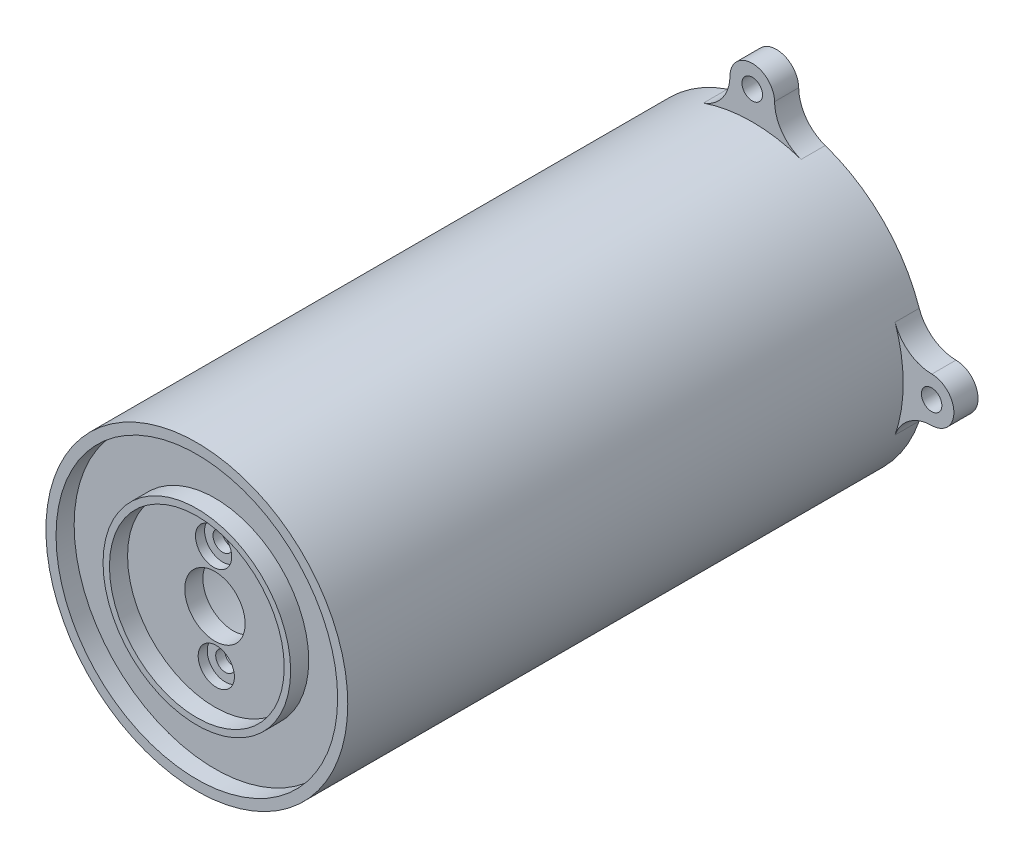
ISO-10303-21;
HEADER;
FILE_DESCRIPTION(('STEP AP214'),'2;1');
FILE_NAME('part.step','',(''),(''),'','','');
FILE_SCHEMA(('AUTOMOTIVE_DESIGN { 1 0 10303 214 1 1 1 1 }'));
ENDSEC;
DATA;
#1=APPLICATION_CONTEXT('core data for automotive mechanical design processes');
#2=APPLICATION_PROTOCOL_DEFINITION('international standard','automotive_design',2000,#1);
#3=PRODUCT_CONTEXT('',#1,'mechanical');
#4=PRODUCT('Part','Part','',(#3));
#5=PRODUCT_RELATED_PRODUCT_CATEGORY('part','',(#4));
#6=PRODUCT_DEFINITION_FORMATION('','',#4);
#7=PRODUCT_DEFINITION_CONTEXT('part definition',#1,'design');
#8=PRODUCT_DEFINITION('design','',#6,#7);
#9=PRODUCT_DEFINITION_SHAPE('','',#8);
#10=(LENGTH_UNIT() NAMED_UNIT(*) SI_UNIT(.MILLI.,.METRE.));
#11=(NAMED_UNIT(*) PLANE_ANGLE_UNIT() SI_UNIT($,.RADIAN.));
#12=(NAMED_UNIT(*) SI_UNIT($,.STERADIAN.) SOLID_ANGLE_UNIT());
#13=UNCERTAINTY_MEASURE_WITH_UNIT(LENGTH_MEASURE(1.E-05),#10,'distance_accuracy_value','');
#14=(GEOMETRIC_REPRESENTATION_CONTEXT(3) GLOBAL_UNCERTAINTY_ASSIGNED_CONTEXT((#13)) GLOBAL_UNIT_ASSIGNED_CONTEXT((#10,
#11,#12)) REPRESENTATION_CONTEXT('',''));
#15=CARTESIAN_POINT('',(0.,0.,0.));
#16=DIRECTION('',(0.,0.,1.));
#17=DIRECTION('',(1.,0.,0.));
#18=AXIS2_PLACEMENT_3D('',#15,#16,#17);
#19=CARTESIAN_POINT('',(0.,0.,93.));
#20=DIRECTION('',(0.,0.,1.));
#21=DIRECTION('',(1.,0.,0.));
#22=AXIS2_PLACEMENT_3D('',#19,#20,#21);
#23=PLANE('',#22);
#24=CARTESIAN_POINT('',(-0.222147672715639,8.49709658715891,93.));
#25=DIRECTION('',(0.,0.,1.));
#26=DIRECTION('',(1.,0.,0.));
#27=AXIS2_PLACEMENT_3D('',#24,#25,#26);
#28=CIRCLE('',#27,3.);
#29=CARTESIAN_POINT('',(2.77785232728436,8.49709658715891,93.));
#30=VERTEX_POINT('',#29);
#31=EDGE_CURVE('E289',#30,#30,#28,.T.);
#32=ORIENTED_EDGE('',*,*,#31,.F.);
#33=EDGE_LOOP('',(#32));
#34=FACE_BOUND('',#33,.T.);
#35=CARTESIAN_POINT('',(0.222147672715695,-8.49709658715891,93.));
#36=DIRECTION('',(0.,0.,1.));
#37=DIRECTION('',(1.,0.,0.));
#38=AXIS2_PLACEMENT_3D('',#35,#36,#37);
#39=CIRCLE('',#38,3.);
#40=CARTESIAN_POINT('',(3.22214767271569,-8.49709658715891,93.));
#41=VERTEX_POINT('',#40);
#42=EDGE_CURVE('E292',#41,#41,#39,.T.);
#43=ORIENTED_EDGE('',*,*,#42,.F.);
#44=EDGE_LOOP('',(#43));
#45=FACE_BOUND('',#44,.T.);
#46=CARTESIAN_POINT('',(0.,0.,93.));
#47=DIRECTION('',(0.,0.,1.));
#48=DIRECTION('',(1.,0.,0.));
#49=AXIS2_PLACEMENT_3D('',#46,#47,#48);
#50=CIRCLE('',#49,5.);
#51=CARTESIAN_POINT('',(5.00000000000003,0.,93.));
#52=VERTEX_POINT('',#51);
#53=EDGE_CURVE('E306',#52,#52,#50,.T.);
#54=ORIENTED_EDGE('',*,*,#53,.F.);
#55=EDGE_LOOP('',(#54));
#56=FACE_BOUND('',#55,.T.);
#57=CARTESIAN_POINT('',(0.,0.,93.));
#58=DIRECTION('',(0.,0.,1.));
#59=DIRECTION('',(1.,0.,0.));
#60=AXIS2_PLACEMENT_3D('',#57,#58,#59);
#61=CIRCLE('',#60,14.4751675605041);
#62=CARTESIAN_POINT('',(14.4751675605041,0.,93.));
#63=VERTEX_POINT('',#62);
#64=EDGE_CURVE('E12',#63,#63,#61,.F.);
#65=ORIENTED_EDGE('',*,*,#64,.F.);
#66=EDGE_LOOP('',(#65));
#67=FACE_BOUND('',#66,.T.);
#68=ADVANCED_FACE('F45',(#34,#45,#56,#67),#23,.T.);
#69=CARTESIAN_POINT('',(0.222147672715695,-8.49709658715891,93.));
#70=DIRECTION('',(0.,0.,-1.));
#71=DIRECTION('',(-1.,0.,0.));
#72=AXIS2_PLACEMENT_3D('',#69,#70,#71);
#73=CYLINDRICAL_SURFACE('',#72,1.60000000000014);
#74=CARTESIAN_POINT('',(0.222147672715695,-8.49709658715891,90.));
#75=DIRECTION('',(0.,0.,1.));
#76=DIRECTION('',(1.,0.,0.));
#77=AXIS2_PLACEMENT_3D('',#74,#75,#76);
#78=CIRCLE('',#77,1.60000000000014);
#79=CARTESIAN_POINT('',(1.82214767271583,-8.49709658715891,90.));
#80=VERTEX_POINT('',#79);
#81=EDGE_CURVE('E301',#80,#80,#78,.T.);
#82=ORIENTED_EDGE('',*,*,#81,.F.);
#83=EDGE_LOOP('',(#82));
#84=FACE_BOUND('',#83,.T.);
#85=CARTESIAN_POINT('',(0.222147672715695,-8.49709658715891,91.5));
#86=DIRECTION('',(0.,0.,1.));
#87=DIRECTION('',(1.,0.,0.));
#88=AXIS2_PLACEMENT_3D('',#85,#86,#87);
#89=CIRCLE('',#88,1.60000000000014);
#90=CARTESIAN_POINT('',(1.82214767271583,-8.49709658715891,91.5));
#91=VERTEX_POINT('',#90);
#92=EDGE_CURVE('E302',#91,#91,#89,.T.);
#93=ORIENTED_EDGE('',*,*,#92,.T.);
#94=EDGE_LOOP('',(#93));
#95=FACE_BOUND('',#94,.T.);
#96=ADVANCED_FACE('F349',(#84,#95),#73,.F.);
#97=CARTESIAN_POINT('',(-0.222147672715639,8.49709658715891,93.));
#98=DIRECTION('',(0.,0.,-1.));
#99=DIRECTION('',(-1.,0.,0.));
#100=AXIS2_PLACEMENT_3D('',#97,#98,#99);
#101=CYLINDRICAL_SURFACE('',#100,1.60000000000014);
#102=CARTESIAN_POINT('',(-0.222147672715639,8.49709658715891,90.));
#103=DIRECTION('',(0.,0.,1.));
#104=DIRECTION('',(1.,0.,0.));
#105=AXIS2_PLACEMENT_3D('',#102,#103,#104);
#106=CIRCLE('',#105,1.60000000000014);
#107=CARTESIAN_POINT('',(1.3778523272845,8.49709658715891,90.));
#108=VERTEX_POINT('',#107);
#109=EDGE_CURVE('E298',#108,#108,#106,.T.);
#110=ORIENTED_EDGE('',*,*,#109,.F.);
#111=EDGE_LOOP('',(#110));
#112=FACE_BOUND('',#111,.T.);
#113=CARTESIAN_POINT('',(-0.222147672715639,8.49709658715891,91.5));
#114=DIRECTION('',(0.,0.,1.));
#115=DIRECTION('',(1.,0.,0.));
#116=AXIS2_PLACEMENT_3D('',#113,#114,#115);
#117=CIRCLE('',#116,1.60000000000014);
#118=CARTESIAN_POINT('',(1.3778523272845,8.49709658715891,91.5));
#119=VERTEX_POINT('',#118);
#120=EDGE_CURVE('E288',#119,#119,#117,.T.);
#121=ORIENTED_EDGE('',*,*,#120,.T.);
#122=EDGE_LOOP('',(#121));
#123=FACE_BOUND('',#122,.T.);
#124=ADVANCED_FACE('F355',(#112,#123),#101,.F.);
#125=CARTESIAN_POINT('',(0.,0.,0.));
#126=DIRECTION('',(0.,0.,1.));
#127=DIRECTION('',(1.,0.,0.));
#128=AXIS2_PLACEMENT_3D('',#125,#126,#127);
#129=PLANE('',#128);
#130=CARTESIAN_POINT('',(0.,0.,0.));
#131=DIRECTION('',(0.,0.,1.));
#132=DIRECTION('',(1.,0.,0.));
#133=AXIS2_PLACEMENT_3D('',#130,#131,#132);
#134=CIRCLE('',#133,25.);
#135=CARTESIAN_POINT('',(23.6554109952273,8.08835772248491,0.));
#136=VERTEX_POINT('',#135);
#137=CARTESIAN_POINT('',(8.08835772248466,23.6554109952273,0.));
#138=VERTEX_POINT('',#137);
#139=EDGE_CURVE('E318',#136,#138,#134,.T.);
#140=ORIENTED_EDGE('',*,*,#139,.F.);
#141=CARTESIAN_POINT('',(29.8058178539863,10.191330730331,0.));
#142=DIRECTION('',(0.,0.,1.));
#143=DIRECTION('',(-1.,0.,0.));
#144=AXIS2_PLACEMENT_3D('',#141,#142,#143);
#145=CIRCLE('',#144,6.5);
#146=CARTESIAN_POINT('',(29.7425959776503,3.69163819957597,0.));
#147=VERTEX_POINT('',#146);
#148=EDGE_CURVE('E244',#136,#147,#145,.T.);
#149=ORIENTED_EDGE('',*,*,#148,.T.);
#150=CARTESIAN_POINT('',(29.706687772358,1.03720345996027E-13,0.));
#151=DIRECTION('',(0.,0.,-1.));
#152=DIRECTION('',(-1.,0.,0.));
#153=AXIS2_PLACEMENT_3D('',#150,#151,#152);
#154=CIRCLE('',#153,3.69181283325347);
#155=CARTESIAN_POINT('',(29.7425959776503,-3.69163819957576,0.));
#156=VERTEX_POINT('',#155);
#157=EDGE_CURVE('E186',#147,#156,#154,.T.);
#158=ORIENTED_EDGE('',*,*,#157,.T.);
#159=CARTESIAN_POINT('',(29.8058178539864,-10.1913307303308,0.));
#160=DIRECTION('',(0.,0.,1.));
#161=DIRECTION('',(1.,0.,0.));
#162=AXIS2_PLACEMENT_3D('',#159,#160,#161);
#163=CIRCLE('',#162,6.5);
#164=CARTESIAN_POINT('',(23.6554109952273,-8.08835772248474,0.));
#165=VERTEX_POINT('',#164);
#166=EDGE_CURVE('E183',#156,#165,#163,.T.);
#167=ORIENTED_EDGE('',*,*,#166,.T.);
#168=CARTESIAN_POINT('',(8.08835772248484,-23.6554109952273,0.));
#169=VERTEX_POINT('',#168);
#170=EDGE_CURVE('E317',#169,#165,#134,.T.);
#171=ORIENTED_EDGE('',*,*,#170,.F.);
#172=CARTESIAN_POINT('',(10.1913307303309,-29.8058178539864,0.));
#173=DIRECTION('',(0.,0.,1.));
#174=DIRECTION('',(-1.,0.,0.));
#175=AXIS2_PLACEMENT_3D('',#172,#173,#174);
#176=CIRCLE('',#175,6.5);
#177=CARTESIAN_POINT('',(3.69163819957586,-29.7425959776503,0.));
#178=VERTEX_POINT('',#177);
#179=EDGE_CURVE('E219',#169,#178,#176,.T.);
#180=ORIENTED_EDGE('',*,*,#179,.T.);
#181=CARTESIAN_POINT('',(0.,-29.706687772358,0.));
#182=DIRECTION('',(0.,0.,-1.));
#183=DIRECTION('',(-1.,0.,0.));
#184=AXIS2_PLACEMENT_3D('',#181,#182,#183);
#185=CIRCLE('',#184,3.69181283325347);
#186=CARTESIAN_POINT('',(-3.69163819957586,-29.7425959776503,0.));
#187=VERTEX_POINT('',#186);
#188=EDGE_CURVE('E162',#178,#187,#185,.T.);
#189=ORIENTED_EDGE('',*,*,#188,.T.);
#190=CARTESIAN_POINT('',(-10.1913307303309,-29.8058178539864,0.));
#191=DIRECTION('',(0.,0.,1.));
#192=DIRECTION('',(1.,0.,0.));
#193=AXIS2_PLACEMENT_3D('',#190,#191,#192);
#194=CIRCLE('',#193,6.5);
#195=CARTESIAN_POINT('',(-8.08835772248483,-23.6554109952273,0.));
#196=VERTEX_POINT('',#195);
#197=EDGE_CURVE('E223',#187,#196,#194,.T.);
#198=ORIENTED_EDGE('',*,*,#197,.T.);
#199=CARTESIAN_POINT('',(-23.6554109952272,-8.08835772248509,0.));
#200=VERTEX_POINT('',#199);
#201=EDGE_CURVE('E547',#200,#196,#134,.T.);
#202=ORIENTED_EDGE('',*,*,#201,.F.);
#203=CARTESIAN_POINT('',(-29.8058178539863,-10.1913307303312,0.));
#204=DIRECTION('',(0.,0.,1.));
#205=DIRECTION('',(-1.,0.,0.));
#206=AXIS2_PLACEMENT_3D('',#203,#204,#205);
#207=CIRCLE('',#206,6.5);
#208=CARTESIAN_POINT('',(-29.7425959776502,-3.69163819957619,0.));
#209=VERTEX_POINT('',#208);
#210=EDGE_CURVE('E226',#200,#209,#207,.T.);
#211=ORIENTED_EDGE('',*,*,#210,.T.);
#212=CARTESIAN_POINT('',(-29.706687772358,-3.18099931891989E-13,0.));
#213=DIRECTION('',(0.,0.,-1.));
#214=DIRECTION('',(-1.,0.,0.));
#215=AXIS2_PLACEMENT_3D('',#212,#213,#214);
#216=CIRCLE('',#215,3.69181283325347);
#217=CARTESIAN_POINT('',(-29.7425959776503,3.69163819957555,0.));
#218=VERTEX_POINT('',#217);
#219=EDGE_CURVE('E229',#209,#218,#216,.T.);
#220=ORIENTED_EDGE('',*,*,#219,.T.);
#221=CARTESIAN_POINT('',(-29.8058178539865,10.1913307303306,0.));
#222=DIRECTION('',(0.,0.,1.));
#223=DIRECTION('',(1.,0.,0.));
#224=AXIS2_PLACEMENT_3D('',#221,#222,#223);
#225=CIRCLE('',#224,6.5);
#226=CARTESIAN_POINT('',(-23.6554109952274,8.08835772248457,0.));
#227=VERTEX_POINT('',#226);
#228=EDGE_CURVE('E232',#218,#227,#225,.T.);
#229=ORIENTED_EDGE('',*,*,#228,.T.);
#230=CARTESIAN_POINT('',(-8.08835772248499,23.6554109952272,0.));
#231=VERTEX_POINT('',#230);
#232=EDGE_CURVE('E320',#231,#227,#134,.T.);
#233=ORIENTED_EDGE('',*,*,#232,.F.);
#234=CARTESIAN_POINT('',(-10.1913307303311,29.8058178539863,0.));
#235=DIRECTION('',(0.,0.,1.));
#236=DIRECTION('',(-1.,0.,0.));
#237=AXIS2_PLACEMENT_3D('',#234,#235,#236);
#238=CIRCLE('',#237,6.5);
#239=CARTESIAN_POINT('',(-3.69163819957607,29.7425959776502,0.));
#240=VERTEX_POINT('',#239);
#241=EDGE_CURVE('E235',#231,#240,#238,.T.);
#242=ORIENTED_EDGE('',*,*,#241,.T.);
#243=CARTESIAN_POINT('',(-2.03971245040101E-13,29.706687772358,0.));
#244=DIRECTION('',(0.,0.,-1.));
#245=DIRECTION('',(-1.,0.,0.));
#246=AXIS2_PLACEMENT_3D('',#243,#244,#245);
#247=CIRCLE('',#246,3.69181283325347);
#248=CARTESIAN_POINT('',(3.69163819957566,29.7425959776503,0.));
#249=VERTEX_POINT('',#248);
#250=EDGE_CURVE('E238',#240,#249,#247,.T.);
#251=ORIENTED_EDGE('',*,*,#250,.T.);
#252=CARTESIAN_POINT('',(10.1913307303307,29.8058178539865,0.));
#253=DIRECTION('',(0.,0.,1.));
#254=DIRECTION('',(1.,0.,0.));
#255=AXIS2_PLACEMENT_3D('',#252,#253,#254);
#256=CIRCLE('',#255,6.5);
#257=EDGE_CURVE('E241',#249,#138,#256,.T.);
#258=ORIENTED_EDGE('',*,*,#257,.T.);
#259=EDGE_LOOP('',(#140,#149,#158,#167,#171,#180,#189,#198,#202,#211,#220,#229,#233,#242,#251,#258));
#260=FACE_BOUND('',#259,.T.);
#261=CARTESIAN_POINT('',(0.,0.,0.));
#262=DIRECTION('',(0.,0.,1.));
#263=DIRECTION('',(1.,0.,0.));
#264=AXIS2_PLACEMENT_3D('',#261,#262,#263);
#265=CIRCLE('',#264,24.);
#266=CARTESIAN_POINT('',(-24.,0.,0.));
#267=VERTEX_POINT('',#266);
#268=EDGE_CURVE('E314',#267,#267,#265,.T.);
#269=ORIENTED_EDGE('',*,*,#268,.T.);
#270=EDGE_LOOP('',(#269));
#271=FACE_BOUND('',#270,.T.);
#272=CARTESIAN_POINT('',(-29.706687772358,-3.18099931891989E-13,0.));
#273=DIRECTION('',(0.,0.,-1.));
#274=DIRECTION('',(-1.,0.,0.));
#275=AXIS2_PLACEMENT_3D('',#272,#273,#274);
#276=CIRCLE('',#275,1.7);
#277=CARTESIAN_POINT('',(-31.406687772358,-3.18099931891989E-13,0.));
#278=VERTEX_POINT('',#277);
#279=EDGE_CURVE('E497',#278,#278,#276,.T.);
#280=ORIENTED_EDGE('',*,*,#279,.F.);
#281=EDGE_LOOP('',(#280));
#282=FACE_BOUND('',#281,.T.);
#283=CARTESIAN_POINT('',(0.,-29.706687772358,0.));
#284=DIRECTION('',(0.,0.,-1.));
#285=DIRECTION('',(-1.,0.,0.));
#286=AXIS2_PLACEMENT_3D('',#283,#284,#285);
#287=CIRCLE('',#286,1.7);
#288=CARTESIAN_POINT('',(-1.7,-29.706687772358,0.));
#289=VERTEX_POINT('',#288);
#290=EDGE_CURVE('E189',#289,#289,#287,.T.);
#291=ORIENTED_EDGE('',*,*,#290,.F.);
#292=EDGE_LOOP('',(#291));
#293=FACE_BOUND('',#292,.T.);
#294=CARTESIAN_POINT('',(29.706687772358,1.03720345996027E-13,0.));
#295=DIRECTION('',(0.,0.,-1.));
#296=DIRECTION('',(-1.,0.,0.));
#297=AXIS2_PLACEMENT_3D('',#294,#295,#296);
#298=CIRCLE('',#297,1.7);
#299=CARTESIAN_POINT('',(28.0066877723579,1.03720345996027E-13,0.));
#300=VERTEX_POINT('',#299);
#301=EDGE_CURVE('E504',#300,#300,#298,.T.);
#302=ORIENTED_EDGE('',*,*,#301,.F.);
#303=EDGE_LOOP('',(#302));
#304=FACE_BOUND('',#303,.T.);
#305=CARTESIAN_POINT('',(-2.03971245040101E-13,29.706687772358,0.));
#306=DIRECTION('',(0.,0.,-1.));
#307=DIRECTION('',(-1.,0.,0.));
#308=AXIS2_PLACEMENT_3D('',#305,#306,#307);
#309=CIRCLE('',#308,1.7);
#310=CARTESIAN_POINT('',(-1.7000000000002,29.706687772358,0.));
#311=VERTEX_POINT('',#310);
#312=EDGE_CURVE('E507',#311,#311,#309,.T.);
#313=ORIENTED_EDGE('',*,*,#312,.F.);
#314=EDGE_LOOP('',(#313));
#315=FACE_BOUND('',#314,.T.);
#316=ADVANCED_FACE('F467',(#260,#271,#282,#293,#304,#315),#129,.F.);
#317=CARTESIAN_POINT('',(0.,0.,90.));
#318=DIRECTION('',(0.,0.,-1.));
#319=DIRECTION('',(-1.,0.,0.));
#320=AXIS2_PLACEMENT_3D('',#317,#318,#319);
#321=CYLINDRICAL_SURFACE('',#320,25.);
#322=DIRECTION('',(0.,0.,-1.));
#323=VECTOR('',#322,1.);
#324=CARTESIAN_POINT('',(-23.6554109952274,8.08835772248457,4.));
#325=LINE('',#324,#323);
#326=CARTESIAN_POINT('',(-23.6554109952274,8.08835772248457,4.));
#327=VERTEX_POINT('',#326);
#328=EDGE_CURVE('E268',#327,#227,#325,.T.);
#329=ORIENTED_EDGE('',*,*,#328,.F.);
#330=CARTESIAN_POINT('',(0.,0.,4.));
#331=DIRECTION('',(0.,0.,-1.));
#332=DIRECTION('',(-1.,0.,0.));
#333=AXIS2_PLACEMENT_3D('',#330,#331,#332);
#334=CIRCLE('',#333,25.);
#335=CARTESIAN_POINT('',(-23.6554109952272,-8.08835772248508,4.));
#336=VERTEX_POINT('',#335);
#337=EDGE_CURVE('E250',#336,#327,#334,.T.);
#338=ORIENTED_EDGE('',*,*,#337,.F.);
#339=DIRECTION('',(0.,0.,-1.));
#340=VECTOR('',#339,1.);
#341=CARTESIAN_POINT('',(-23.6554109952272,-8.08835772248509,4.));
#342=LINE('',#341,#340);
#343=EDGE_CURVE('E275',#336,#200,#342,.T.);
#344=ORIENTED_EDGE('',*,*,#343,.T.);
#345=ORIENTED_EDGE('',*,*,#201,.T.);
#346=DIRECTION('',(0.,0.,-1.));
#347=VECTOR('',#346,1.);
#348=CARTESIAN_POINT('',(-8.08835772248483,-23.6554109952273,4.));
#349=LINE('',#348,#347);
#350=CARTESIAN_POINT('',(-8.08835772248483,-23.6554109952273,4.));
#351=VERTEX_POINT('',#350);
#352=EDGE_CURVE('E278',#351,#196,#349,.T.);
#353=ORIENTED_EDGE('',*,*,#352,.F.);
#354=CARTESIAN_POINT('',(8.08835772248483,-23.6554109952273,4.));
#355=VERTEX_POINT('',#354);
#356=EDGE_CURVE('E284',#355,#351,#334,.T.);
#357=ORIENTED_EDGE('',*,*,#356,.F.);
#358=DIRECTION('',(0.,0.,-1.));
#359=VECTOR('',#358,1.);
#360=CARTESIAN_POINT('',(8.08835772248484,-23.6554109952273,4.));
#361=LINE('',#360,#359);
#362=EDGE_CURVE('E182',#355,#169,#361,.T.);
#363=ORIENTED_EDGE('',*,*,#362,.T.);
#364=ORIENTED_EDGE('',*,*,#170,.T.);
#365=DIRECTION('',(0.,0.,-1.));
#366=VECTOR('',#365,1.);
#367=CARTESIAN_POINT('',(23.6554109952273,-8.08835772248474,4.));
#368=LINE('',#367,#366);
#369=CARTESIAN_POINT('',(23.6554109952273,-8.08835772248474,4.));
#370=VERTEX_POINT('',#369);
#371=EDGE_CURVE('E251',#370,#165,#368,.T.);
#372=ORIENTED_EDGE('',*,*,#371,.F.);
#373=CARTESIAN_POINT('',(23.6554109952273,8.08835772248491,4.));
#374=VERTEX_POINT('',#373);
#375=EDGE_CURVE('E540',#374,#370,#334,.T.);
#376=ORIENTED_EDGE('',*,*,#375,.F.);
#377=DIRECTION('',(0.,0.,-1.));
#378=VECTOR('',#377,1.);
#379=CARTESIAN_POINT('',(23.6554109952273,8.08835772248491,4.));
#380=LINE('',#379,#378);
#381=EDGE_CURVE('E258',#374,#136,#380,.T.);
#382=ORIENTED_EDGE('',*,*,#381,.T.);
#383=ORIENTED_EDGE('',*,*,#139,.T.);
#384=DIRECTION('',(0.,0.,-1.));
#385=VECTOR('',#384,1.);
#386=CARTESIAN_POINT('',(8.08835772248467,23.6554109952273,4.));
#387=LINE('',#386,#385);
#388=CARTESIAN_POINT('',(8.08835772248467,23.6554109952273,4.));
#389=VERTEX_POINT('',#388);
#390=EDGE_CURVE('E65',#389,#138,#387,.T.);
#391=ORIENTED_EDGE('',*,*,#390,.F.);
#392=CARTESIAN_POINT('',(-8.08835772248499,23.6554109952272,4.));
#393=VERTEX_POINT('',#392);
#394=EDGE_CURVE('E60',#393,#389,#334,.T.);
#395=ORIENTED_EDGE('',*,*,#394,.F.);
#396=DIRECTION('',(0.,0.,-1.));
#397=VECTOR('',#396,1.);
#398=CARTESIAN_POINT('',(-8.08835772248499,23.6554109952272,4.));
#399=LINE('',#398,#397);
#400=EDGE_CURVE('E266',#393,#231,#399,.T.);
#401=ORIENTED_EDGE('',*,*,#400,.T.);
#402=ORIENTED_EDGE('',*,*,#232,.T.);
#403=EDGE_LOOP('',(#329,#338,#344,#345,#353,#357,#363,#364,#372,#376,#382,#383,#391,#395,#401,#402));
#404=FACE_BOUND('',#403,.T.);
#405=CARTESIAN_POINT('',(0.,0.,96.));
#406=DIRECTION('',(0.,0.,1.));
#407=DIRECTION('',(1.,0.,0.));
#408=AXIS2_PLACEMENT_3D('',#405,#406,#407);
#409=CIRCLE('',#408,25.);
#410=CARTESIAN_POINT('',(25.,0.,96.));
#411=VERTEX_POINT('',#410);
#412=EDGE_CURVE('E565',#411,#411,#409,.T.);
#413=ORIENTED_EDGE('',*,*,#412,.F.);
#414=EDGE_LOOP('',(#413));
#415=FACE_BOUND('',#414,.T.);
#416=ADVANCED_FACE('F47',(#404,#415),#321,.T.);
#417=CARTESIAN_POINT('',(0.,0.,90.));
#418=DIRECTION('',(0.,0.,-1.));
#419=DIRECTION('',(-1.,0.,0.));
#420=AXIS2_PLACEMENT_3D('',#417,#418,#419);
#421=CYLINDRICAL_SURFACE('',#420,24.);
#422=CARTESIAN_POINT('',(0.,0.,90.));
#423=DIRECTION('',(0.,0.,1.));
#424=DIRECTION('',(1.,0.,0.));
#425=AXIS2_PLACEMENT_3D('',#422,#423,#424);
#426=CIRCLE('',#425,24.);
#427=CARTESIAN_POINT('',(-24.,0.,90.));
#428=VERTEX_POINT('',#427);
#429=EDGE_CURVE('E309',#428,#428,#426,.T.);
#430=CARTESIAN_POINT('',(-24.,0.,0.));
#431=CARTESIAN_POINT('',(-24.,0.,0.937499999999986));
#432=CARTESIAN_POINT('',(-24.,0.,1.87499999999998));
#433=CARTESIAN_POINT('',(-24.,0.,3.74999999999998));
#434=CARTESIAN_POINT('',(-24.,0.,4.68749999999999));
#435=CARTESIAN_POINT('',(-24.,0.,6.56249999999999));
#436=CARTESIAN_POINT('',(-24.,0.,7.49999999999999));
#437=CARTESIAN_POINT('',(-24.,0.,9.37499999999999));
#438=CARTESIAN_POINT('',(-24.,0.,10.3125));
#439=CARTESIAN_POINT('',(-24.,0.,12.1875));
#440=CARTESIAN_POINT('',(-24.,0.,13.125));
#441=CARTESIAN_POINT('',(-24.,0.,15.));
#442=CARTESIAN_POINT('',(-24.,0.,15.9375));
#443=CARTESIAN_POINT('',(-24.,0.,17.8125));
#444=CARTESIAN_POINT('',(-24.,0.,18.75));
#445=CARTESIAN_POINT('',(-24.,0.,20.625));
#446=CARTESIAN_POINT('',(-24.,0.,21.5625));
#447=CARTESIAN_POINT('',(-24.,0.,23.4375));
#448=CARTESIAN_POINT('',(-24.,0.,24.375));
#449=CARTESIAN_POINT('',(-24.,0.,26.25));
#450=CARTESIAN_POINT('',(-24.,0.,27.1875));
#451=CARTESIAN_POINT('',(-24.,0.,29.0625));
#452=CARTESIAN_POINT('',(-24.,0.,30.));
#453=CARTESIAN_POINT('',(-24.,0.,31.875));
#454=CARTESIAN_POINT('',(-24.,0.,32.8125));
#455=CARTESIAN_POINT('',(-24.,0.,34.6875));
#456=CARTESIAN_POINT('',(-24.,0.,35.625));
#457=CARTESIAN_POINT('',(-24.,0.,37.5));
#458=CARTESIAN_POINT('',(-24.,0.,38.4375));
#459=CARTESIAN_POINT('',(-24.,0.,40.3125));
#460=CARTESIAN_POINT('',(-24.,0.,41.25));
#461=CARTESIAN_POINT('',(-24.,0.,43.125));
#462=CARTESIAN_POINT('',(-24.,0.,44.0625));
#463=CARTESIAN_POINT('',(-24.,0.,45.9375));
#464=CARTESIAN_POINT('',(-24.,0.,46.875));
#465=CARTESIAN_POINT('',(-24.,0.,48.75));
#466=CARTESIAN_POINT('',(-24.,0.,49.6875));
#467=CARTESIAN_POINT('',(-24.,0.,51.5625));
#468=CARTESIAN_POINT('',(-24.,0.,52.5));
#469=CARTESIAN_POINT('',(-24.,0.,54.375));
#470=CARTESIAN_POINT('',(-24.,0.,55.3125));
#471=CARTESIAN_POINT('',(-24.,0.,57.1875));
#472=CARTESIAN_POINT('',(-24.,0.,58.125));
#473=CARTESIAN_POINT('',(-24.,0.,60.));
#474=CARTESIAN_POINT('',(-24.,0.,60.9375));
#475=CARTESIAN_POINT('',(-24.,0.,62.8125));
#476=CARTESIAN_POINT('',(-24.,0.,63.75));
#477=CARTESIAN_POINT('',(-24.,0.,65.625));
#478=CARTESIAN_POINT('',(-24.,0.,66.5625));
#479=CARTESIAN_POINT('',(-24.,0.,68.4375));
#480=CARTESIAN_POINT('',(-24.,0.,69.375));
#481=CARTESIAN_POINT('',(-24.,0.,71.25));
#482=CARTESIAN_POINT('',(-24.,0.,72.1875));
#483=CARTESIAN_POINT('',(-24.,0.,74.0625));
#484=CARTESIAN_POINT('',(-24.,0.,75.));
#485=CARTESIAN_POINT('',(-24.,0.,76.875));
#486=CARTESIAN_POINT('',(-24.,0.,77.8125));
#487=CARTESIAN_POINT('',(-24.,0.,79.6875));
#488=CARTESIAN_POINT('',(-24.,0.,80.625));
#489=CARTESIAN_POINT('',(-24.,0.,82.5));
#490=CARTESIAN_POINT('',(-24.,0.,83.4375));
#491=CARTESIAN_POINT('',(-24.,0.,85.3125));
#492=CARTESIAN_POINT('',(-24.,0.,86.25));
#493=CARTESIAN_POINT('',(-24.,0.,88.125));
#494=CARTESIAN_POINT('',(-24.,0.,89.0625));
#495=CARTESIAN_POINT('',(-24.,0.,90.));
#496=B_SPLINE_CURVE_WITH_KNOTS('',3,(#430,#431,#432,#433,#434,#435,#436,#437,#438,#439,#440,
#441,#442,#443,#444,#445,#446,#447,#448,#449,#450,#451,#452,#453,#454,#455,#456,#457,#458,#459,
#460,#461,#462,#463,#464,#465,#466,#467,#468,#469,#470,#471,#472,#473,#474,#475,#476,#477,#478,
#479,#480,#481,#482,#483,#484,#485,#486,#487,#488,#489,#490,#491,#492,#493,#494,#495),
.UNSPECIFIED.,.F.,.F.,(4,2,2,2,2,2,2,2,2,2,2,2,2,2,2,2,2,2,2,2,2,2,2,2,2,2,2,2,2,2,2,2,4),(0.,
2.8125,5.62500000000001,8.4375,11.25,14.0625,16.875,19.6875,22.5,25.3125,28.125,30.9375,33.75,
36.5625,39.375,42.1875,45.,47.8125,50.625,53.4375,56.25,59.0625,61.875,64.6875,67.5,70.3125,
73.125,75.9375,78.75,81.5625,84.375,87.1875,90.),.UNSPECIFIED.);
#497=EDGE_CURVE('BSEAM344',#267,#428,#496,.T.);
#498=ORIENTED_EDGE('',*,*,#268,.F.);
#499=ORIENTED_EDGE('',*,*,#429,.T.);
#500=ORIENTED_EDGE('',*,*,#497,.T.);
#501=ORIENTED_EDGE('',*,*,#497,.F.);
#502=EDGE_LOOP('',(#498,#500,#499,#501));
#503=FACE_BOUND('',#502,.T.);
#504=ADVANCED_FACE('F344',(#503),#421,.F.);
#505=CARTESIAN_POINT('',(0.,0.,90.));
#506=DIRECTION('',(0.,0.,1.));
#507=DIRECTION('',(1.,0.,0.));
#508=AXIS2_PLACEMENT_3D('',#505,#506,#507);
#509=PLANE('',#508);
#510=ORIENTED_EDGE('',*,*,#109,.T.);
#511=EDGE_LOOP('',(#510));
#512=FACE_BOUND('',#511,.T.);
#513=ORIENTED_EDGE('',*,*,#81,.T.);
#514=EDGE_LOOP('',(#513));
#515=FACE_BOUND('',#514,.T.);
#516=CARTESIAN_POINT('',(0.,0.,90.));
#517=DIRECTION('',(0.,0.,1.));
#518=DIRECTION('',(1.,0.,0.));
#519=AXIS2_PLACEMENT_3D('',#516,#517,#518);
#520=CIRCLE('',#519,5.);
#521=CARTESIAN_POINT('',(5.00000000000003,0.,90.));
#522=VERTEX_POINT('',#521);
#523=EDGE_CURVE('E305',#522,#522,#520,.T.);
#524=ORIENTED_EDGE('',*,*,#523,.T.);
#525=EDGE_LOOP('',(#524));
#526=FACE_BOUND('',#525,.T.);
#527=ORIENTED_EDGE('',*,*,#429,.F.);
#528=EDGE_LOOP('',(#527));
#529=FACE_BOUND('',#528,.T.);
#530=ADVANCED_FACE('F332',(#512,#515,#526,#529),#509,.F.);
#531=CARTESIAN_POINT('',(0.,0.,93.));
#532=DIRECTION('',(0.,0.,1.));
#533=DIRECTION('',(1.,0.,0.));
#534=AXIS2_PLACEMENT_3D('',#531,#532,#533);
#535=CIRCLE('',#534,15.5382953269393);
#536=CARTESIAN_POINT('',(15.5382953269393,0.,93.));
#537=VERTEX_POINT('',#536);
#538=EDGE_CURVE('E573',#537,#537,#535,.T.);
#539=ORIENTED_EDGE('',*,*,#538,.F.);
#540=EDGE_LOOP('',(#539));
#541=FACE_BOUND('',#540,.T.);
#542=CARTESIAN_POINT('',(0.,0.,93.));
#543=DIRECTION('',(0.,0.,1.));
#544=DIRECTION('',(1.,0.,0.));
#545=AXIS2_PLACEMENT_3D('',#542,#543,#544);
#546=CIRCLE('',#545,23.3221048885453);
#547=CARTESIAN_POINT('',(23.3221048885453,0.,93.));
#548=VERTEX_POINT('',#547);
#549=EDGE_CURVE('E53',#548,#548,#546,.F.);
#550=ORIENTED_EDGE('',*,*,#549,.F.);
#551=EDGE_LOOP('',(#550));
#552=FACE_BOUND('',#551,.T.);
#553=ADVANCED_FACE('F329',(#541,#552),#23,.T.);
#554=CARTESIAN_POINT('',(0.,0.,93.));
#555=DIRECTION('',(0.,0.,-1.));
#556=DIRECTION('',(-1.,0.,0.));
#557=AXIS2_PLACEMENT_3D('',#554,#555,#556);
#558=CYLINDRICAL_SURFACE('',#557,5.);
#559=ORIENTED_EDGE('',*,*,#53,.T.);
#560=EDGE_LOOP('',(#559));
#561=FACE_BOUND('',#560,.T.);
#562=ORIENTED_EDGE('',*,*,#523,.F.);
#563=EDGE_LOOP('',(#562));
#564=FACE_BOUND('',#563,.T.);
#565=ADVANCED_FACE('F331',(#561,#564),#558,.F.);
#566=CARTESIAN_POINT('',(-0.222147672715639,8.49709658715891,91.5));
#567=DIRECTION('',(0.,0.,1.));
#568=DIRECTION('',(1.,0.,0.));
#569=AXIS2_PLACEMENT_3D('',#566,#567,#568);
#570=CYLINDRICAL_SURFACE('',#569,3.);
#571=CARTESIAN_POINT('',(-0.222147672715639,8.49709658715891,91.5));
#572=DIRECTION('',(0.,0.,1.));
#573=DIRECTION('',(1.,0.,0.));
#574=AXIS2_PLACEMENT_3D('',#571,#572,#573);
#575=CIRCLE('',#574,3.);
#576=CARTESIAN_POINT('',(2.77785232728436,8.49709658715891,91.5));
#577=VERTEX_POINT('',#576);
#578=EDGE_CURVE('E285',#577,#577,#575,.T.);
#579=ORIENTED_EDGE('',*,*,#578,.F.);
#580=EDGE_LOOP('',(#579));
#581=FACE_BOUND('',#580,.T.);
#582=ORIENTED_EDGE('',*,*,#31,.T.);
#583=EDGE_LOOP('',(#582));
#584=FACE_BOUND('',#583,.T.);
#585=ADVANCED_FACE('F340',(#581,#584),#570,.F.);
#586=CARTESIAN_POINT('',(-0.222147672715639,8.49709658715891,91.5));
#587=DIRECTION('',(0.,0.,1.));
#588=DIRECTION('',(1.,0.,0.));
#589=AXIS2_PLACEMENT_3D('',#586,#587,#588);
#590=PLANE('',#589);
#591=ORIENTED_EDGE('',*,*,#120,.F.);
#592=EDGE_LOOP('',(#591));
#593=FACE_BOUND('',#592,.T.);
#594=ORIENTED_EDGE('',*,*,#578,.T.);
#595=EDGE_LOOP('',(#594));
#596=FACE_BOUND('',#595,.T.);
#597=ADVANCED_FACE('F452',(#593,#596),#590,.T.);
#598=CARTESIAN_POINT('',(0.222147672715695,-8.49709658715891,91.5));
#599=DIRECTION('',(0.,0.,1.));
#600=DIRECTION('',(1.,0.,0.));
#601=AXIS2_PLACEMENT_3D('',#598,#599,#600);
#602=CYLINDRICAL_SURFACE('',#601,3.);
#603=CARTESIAN_POINT('',(0.222147672715695,-8.49709658715891,91.5));
#604=DIRECTION('',(0.,0.,1.));
#605=DIRECTION('',(1.,0.,0.));
#606=AXIS2_PLACEMENT_3D('',#603,#604,#605);
#607=CIRCLE('',#606,3.);
#608=CARTESIAN_POINT('',(3.22214767271569,-8.49709658715891,91.5));
#609=VERTEX_POINT('',#608);
#610=EDGE_CURVE('E295',#609,#609,#607,.T.);
#611=ORIENTED_EDGE('',*,*,#610,.F.);
#612=EDGE_LOOP('',(#611));
#613=FACE_BOUND('',#612,.T.);
#614=ORIENTED_EDGE('',*,*,#42,.T.);
#615=EDGE_LOOP('',(#614));
#616=FACE_BOUND('',#615,.T.);
#617=ADVANCED_FACE('F455',(#613,#616),#602,.F.);
#618=CARTESIAN_POINT('',(0.222147672715695,-8.49709658715891,91.5));
#619=DIRECTION('',(0.,0.,1.));
#620=DIRECTION('',(1.,0.,0.));
#621=AXIS2_PLACEMENT_3D('',#618,#619,#620);
#622=PLANE('',#621);
#623=ORIENTED_EDGE('',*,*,#92,.F.);
#624=EDGE_LOOP('',(#623));
#625=FACE_BOUND('',#624,.T.);
#626=ORIENTED_EDGE('',*,*,#610,.T.);
#627=EDGE_LOOP('',(#626));
#628=FACE_BOUND('',#627,.T.);
#629=ADVANCED_FACE('F439',(#625,#628),#622,.T.);
#630=CARTESIAN_POINT('',(-29.706687772358,-3.18099931891989E-13,4.));
#631=DIRECTION('',(0.,0.,-1.));
#632=DIRECTION('',(-1.,0.,0.));
#633=AXIS2_PLACEMENT_3D('',#630,#631,#632);
#634=CYLINDRICAL_SURFACE('',#633,3.69181283325347);
#635=ORIENTED_EDGE('',*,*,#219,.F.);
#636=DIRECTION('',(0.,0.,-1.));
#637=VECTOR('',#636,1.);
#638=CARTESIAN_POINT('',(-29.7425959776502,-3.69163819957619,4.));
#639=LINE('',#638,#637);
#640=CARTESIAN_POINT('',(-29.7425959776502,-3.69163819957619,4.));
#641=VERTEX_POINT('',#640);
#642=EDGE_CURVE('E273',#641,#209,#639,.T.);
#643=ORIENTED_EDGE('',*,*,#642,.F.);
#644=CARTESIAN_POINT('',(-29.706687772358,-3.18099931891989E-13,4.));
#645=DIRECTION('',(0.,0.,-1.));
#646=DIRECTION('',(-1.,0.,0.));
#647=AXIS2_PLACEMENT_3D('',#644,#645,#646);
#648=CIRCLE('',#647,3.69181283325347);
#649=CARTESIAN_POINT('',(-29.7425959776503,3.69163819957555,4.));
#650=VERTEX_POINT('',#649);
#651=EDGE_CURVE('E196',#641,#650,#648,.T.);
#652=ORIENTED_EDGE('',*,*,#651,.T.);
#653=DIRECTION('',(0.,0.,-1.));
#654=VECTOR('',#653,1.);
#655=CARTESIAN_POINT('',(-29.7425959776503,3.69163819957555,4.));
#656=LINE('',#655,#654);
#657=EDGE_CURVE('E271',#650,#218,#656,.T.);
#658=ORIENTED_EDGE('',*,*,#657,.T.);
#659=EDGE_LOOP('',(#635,#643,#652,#658));
#660=FACE_BOUND('',#659,.T.);
#661=ADVANCED_FACE('F391',(#660),#634,.T.);
#662=CARTESIAN_POINT('',(-29.706687772358,-3.18099931891989E-13,4.));
#663=DIRECTION('',(0.,0.,-1.));
#664=DIRECTION('',(-1.,0.,0.));
#665=AXIS2_PLACEMENT_3D('',#662,#663,#664);
#666=CYLINDRICAL_SURFACE('',#665,1.7);
#667=CARTESIAN_POINT('',(-29.706687772358,-3.18099931891989E-13,4.));
#668=DIRECTION('',(0.,0.,-1.));
#669=DIRECTION('',(-1.,0.,0.));
#670=AXIS2_PLACEMENT_3D('',#667,#668,#669);
#671=CIRCLE('',#670,1.7);
#672=CARTESIAN_POINT('',(-31.406687772358,-3.18099931891989E-13,4.));
#673=VERTEX_POINT('',#672);
#674=EDGE_CURVE('E510',#673,#673,#671,.T.);
#675=ORIENTED_EDGE('',*,*,#674,.F.);
#676=EDGE_LOOP('',(#675));
#677=FACE_BOUND('',#676,.T.);
#678=ORIENTED_EDGE('',*,*,#279,.T.);
#679=EDGE_LOOP('',(#678));
#680=FACE_BOUND('',#679,.T.);
#681=ADVANCED_FACE('F387',(#677,#680),#666,.F.);
#682=CARTESIAN_POINT('',(5.09566536516544,-14.9029089269932,4.));
#683=DIRECTION('',(0.,0.,-1.));
#684=DIRECTION('',(-1.,0.,0.));
#685=AXIS2_PLACEMENT_3D('',#682,#683,#684);
#686=PLANE('',#685);
#687=ORIENTED_EDGE('',*,*,#674,.T.);
#688=EDGE_LOOP('',(#687));
#689=FACE_BOUND('',#688,.T.);
#690=CARTESIAN_POINT('',(-29.8058178539863,-10.1913307303312,4.));
#691=DIRECTION('',(0.,0.,1.));
#692=DIRECTION('',(-1.,0.,0.));
#693=AXIS2_PLACEMENT_3D('',#690,#691,#692);
#694=CIRCLE('',#693,6.5);
#695=EDGE_CURVE('E193',#336,#641,#694,.T.);
#696=ORIENTED_EDGE('',*,*,#695,.F.);
#697=ORIENTED_EDGE('',*,*,#337,.T.);
#698=CARTESIAN_POINT('',(-29.8058178539865,10.1913307303306,4.));
#699=DIRECTION('',(0.,0.,1.));
#700=DIRECTION('',(1.,0.,0.));
#701=AXIS2_PLACEMENT_3D('',#698,#699,#700);
#702=CIRCLE('',#701,6.5);
#703=EDGE_CURVE('E199',#650,#327,#702,.T.);
#704=ORIENTED_EDGE('',*,*,#703,.F.);
#705=ORIENTED_EDGE('',*,*,#651,.F.);
#706=EDGE_LOOP('',(#696,#697,#704,#705));
#707=FACE_BOUND('',#706,.T.);
#708=ADVANCED_FACE('F390',(#689,#707),#686,.F.);
#709=CARTESIAN_POINT('',(-29.8058178539863,-10.1913307303312,4.));
#710=DIRECTION('',(0.,0.,-1.));
#711=DIRECTION('',(-1.,0.,0.));
#712=AXIS2_PLACEMENT_3D('',#709,#710,#711);
#713=CYLINDRICAL_SURFACE('',#712,6.5);
#714=ORIENTED_EDGE('',*,*,#210,.F.);
#715=ORIENTED_EDGE('',*,*,#343,.F.);
#716=ORIENTED_EDGE('',*,*,#695,.T.);
#717=ORIENTED_EDGE('',*,*,#642,.T.);
#718=EDGE_LOOP('',(#714,#715,#716,#717));
#719=FACE_BOUND('',#718,.T.);
#720=ADVANCED_FACE('F435',(#719),#713,.F.);
#721=CARTESIAN_POINT('',(-29.8058178539865,10.1913307303306,4.));
#722=DIRECTION('',(0.,0.,-1.));
#723=DIRECTION('',(-1.,0.,0.));
#724=AXIS2_PLACEMENT_3D('',#721,#722,#723);
#725=CYLINDRICAL_SURFACE('',#724,6.5);
#726=ORIENTED_EDGE('',*,*,#228,.F.);
#727=ORIENTED_EDGE('',*,*,#657,.F.);
#728=ORIENTED_EDGE('',*,*,#703,.T.);
#729=ORIENTED_EDGE('',*,*,#328,.T.);
#730=EDGE_LOOP('',(#726,#727,#728,#729));
#731=FACE_BOUND('',#730,.T.);
#732=ADVANCED_FACE('F432',(#731),#725,.F.);
#733=CARTESIAN_POINT('',(0.,-29.706687772358,4.));
#734=DIRECTION('',(0.,0.,-1.));
#735=DIRECTION('',(-1.,0.,0.));
#736=AXIS2_PLACEMENT_3D('',#733,#734,#735);
#737=CYLINDRICAL_SURFACE('',#736,3.69181283325347);
#738=ORIENTED_EDGE('',*,*,#188,.F.);
#739=DIRECTION('',(0.,0.,-1.));
#740=VECTOR('',#739,1.);
#741=CARTESIAN_POINT('',(3.69163819957586,-29.7425959776503,4.));
#742=LINE('',#741,#740);
#743=CARTESIAN_POINT('',(3.69163819957586,-29.7425959776503,4.));
#744=VERTEX_POINT('',#743);
#745=EDGE_CURVE('E157',#744,#178,#742,.T.);
#746=ORIENTED_EDGE('',*,*,#745,.F.);
#747=CARTESIAN_POINT('',(0.,-29.706687772358,4.));
#748=DIRECTION('',(0.,0.,-1.));
#749=DIRECTION('',(-1.,0.,0.));
#750=AXIS2_PLACEMENT_3D('',#747,#748,#749);
#751=CIRCLE('',#750,3.69181283325347);
#752=CARTESIAN_POINT('',(-3.69163819957586,-29.7425959776503,4.));
#753=VERTEX_POINT('',#752);
#754=EDGE_CURVE('E160',#744,#753,#751,.T.);
#755=ORIENTED_EDGE('',*,*,#754,.T.);
#756=DIRECTION('',(0.,0.,-1.));
#757=VECTOR('',#756,1.);
#758=CARTESIAN_POINT('',(-3.69163819957586,-29.7425959776503,4.));
#759=LINE('',#758,#757);
#760=EDGE_CURVE('E167',#753,#187,#759,.T.);
#761=ORIENTED_EDGE('',*,*,#760,.T.);
#762=EDGE_LOOP('',(#738,#746,#755,#761));
#763=FACE_BOUND('',#762,.T.);
#764=ADVANCED_FACE('F159',(#763),#737,.T.);
#765=CARTESIAN_POINT('',(0.,-29.706687772358,4.));
#766=DIRECTION('',(0.,0.,-1.));
#767=DIRECTION('',(-1.,0.,0.));
#768=AXIS2_PLACEMENT_3D('',#765,#766,#767);
#769=CYLINDRICAL_SURFACE('',#768,1.7);
#770=CARTESIAN_POINT('',(0.,-29.706687772358,4.));
#771=DIRECTION('',(0.,0.,-1.));
#772=DIRECTION('',(-1.,0.,0.));
#773=AXIS2_PLACEMENT_3D('',#770,#771,#772);
#774=CIRCLE('',#773,1.7);
#775=CARTESIAN_POINT('',(-1.7,-29.706687772358,4.));
#776=VERTEX_POINT('',#775);
#777=EDGE_CURVE('E221',#776,#776,#774,.T.);
#778=ORIENTED_EDGE('',*,*,#777,.F.);
#779=EDGE_LOOP('',(#778));
#780=FACE_BOUND('',#779,.T.);
#781=ORIENTED_EDGE('',*,*,#290,.T.);
#782=EDGE_LOOP('',(#781));
#783=FACE_BOUND('',#782,.T.);
#784=ADVANCED_FACE('F402',(#780,#783),#769,.F.);
#785=ORIENTED_EDGE('',*,*,#777,.T.);
#786=EDGE_LOOP('',(#785));
#787=FACE_BOUND('',#786,.T.);
#788=CARTESIAN_POINT('',(10.1913307303309,-29.8058178539864,4.));
#789=DIRECTION('',(0.,0.,1.));
#790=DIRECTION('',(-1.,0.,0.));
#791=AXIS2_PLACEMENT_3D('',#788,#789,#790);
#792=CIRCLE('',#791,6.5);
#793=EDGE_CURVE('E175',#355,#744,#792,.T.);
#794=ORIENTED_EDGE('',*,*,#793,.F.);
#795=ORIENTED_EDGE('',*,*,#356,.T.);
#796=CARTESIAN_POINT('',(-10.1913307303309,-29.8058178539864,4.));
#797=DIRECTION('',(0.,0.,1.));
#798=DIRECTION('',(1.,0.,0.));
#799=AXIS2_PLACEMENT_3D('',#796,#797,#798);
#800=CIRCLE('',#799,6.5);
#801=EDGE_CURVE('E177',#753,#351,#800,.T.);
#802=ORIENTED_EDGE('',*,*,#801,.F.);
#803=ORIENTED_EDGE('',*,*,#754,.F.);
#804=EDGE_LOOP('',(#794,#795,#802,#803));
#805=FACE_BOUND('',#804,.T.);
#806=ADVANCED_FACE('F173',(#787,#805),#686,.F.);
#807=CARTESIAN_POINT('',(-10.1913307303309,-29.8058178539864,4.));
#808=DIRECTION('',(0.,0.,-1.));
#809=DIRECTION('',(-1.,0.,0.));
#810=AXIS2_PLACEMENT_3D('',#807,#808,#809);
#811=CYLINDRICAL_SURFACE('',#810,6.5);
#812=ORIENTED_EDGE('',*,*,#197,.F.);
#813=ORIENTED_EDGE('',*,*,#760,.F.);
#814=ORIENTED_EDGE('',*,*,#801,.T.);
#815=ORIENTED_EDGE('',*,*,#352,.T.);
#816=EDGE_LOOP('',(#812,#813,#814,#815));
#817=FACE_BOUND('',#816,.T.);
#818=ADVANCED_FACE('F444',(#817),#811,.F.);
#819=CARTESIAN_POINT('',(10.1913307303309,-29.8058178539864,4.));
#820=DIRECTION('',(0.,0.,-1.));
#821=DIRECTION('',(-1.,0.,0.));
#822=AXIS2_PLACEMENT_3D('',#819,#820,#821);
#823=CYLINDRICAL_SURFACE('',#822,6.5);
#824=ORIENTED_EDGE('',*,*,#179,.F.);
#825=ORIENTED_EDGE('',*,*,#362,.F.);
#826=ORIENTED_EDGE('',*,*,#793,.T.);
#827=ORIENTED_EDGE('',*,*,#745,.T.);
#828=EDGE_LOOP('',(#824,#825,#826,#827));
#829=FACE_BOUND('',#828,.T.);
#830=ADVANCED_FACE('F180',(#829),#823,.F.);
#831=CARTESIAN_POINT('',(29.706687772358,1.03720345996027E-13,4.));
#832=DIRECTION('',(0.,0.,-1.));
#833=DIRECTION('',(-1.,0.,0.));
#834=AXIS2_PLACEMENT_3D('',#831,#832,#833);
#835=CYLINDRICAL_SURFACE('',#834,3.69181283325347);
#836=ORIENTED_EDGE('',*,*,#157,.F.);
#837=DIRECTION('',(0.,0.,-1.));
#838=VECTOR('',#837,1.);
#839=CARTESIAN_POINT('',(29.7425959776503,3.69163819957597,4.));
#840=LINE('',#839,#838);
#841=CARTESIAN_POINT('',(29.7425959776503,3.69163819957597,4.));
#842=VERTEX_POINT('',#841);
#843=EDGE_CURVE('E256',#842,#147,#840,.T.);
#844=ORIENTED_EDGE('',*,*,#843,.F.);
#845=CARTESIAN_POINT('',(29.706687772358,1.03720345996027E-13,4.));
#846=DIRECTION('',(0.,0.,-1.));
#847=DIRECTION('',(-1.,0.,0.));
#848=AXIS2_PLACEMENT_3D('',#845,#846,#847);
#849=CIRCLE('',#848,3.69181283325347);
#850=CARTESIAN_POINT('',(29.7425959776503,-3.69163819957576,4.));
#851=VERTEX_POINT('',#850);
#852=EDGE_CURVE('E214',#842,#851,#849,.T.);
#853=ORIENTED_EDGE('',*,*,#852,.T.);
#854=DIRECTION('',(0.,0.,-1.));
#855=VECTOR('',#854,1.);
#856=CARTESIAN_POINT('',(29.7425959776503,-3.69163819957576,4.));
#857=LINE('',#856,#855);
#858=EDGE_CURVE('E254',#851,#156,#857,.T.);
#859=ORIENTED_EDGE('',*,*,#858,.T.);
#860=EDGE_LOOP('',(#836,#844,#853,#859));
#861=FACE_BOUND('',#860,.T.);
#862=ADVANCED_FACE('F400',(#861),#835,.T.);
#863=CARTESIAN_POINT('',(29.706687772358,1.03720345996027E-13,4.));
#864=DIRECTION('',(0.,0.,-1.));
#865=DIRECTION('',(-1.,0.,0.));
#866=AXIS2_PLACEMENT_3D('',#863,#864,#865);
#867=CYLINDRICAL_SURFACE('',#866,1.7);
#868=CARTESIAN_POINT('',(29.706687772358,1.03720345996027E-13,4.));
#869=DIRECTION('',(0.,0.,-1.));
#870=DIRECTION('',(-1.,0.,0.));
#871=AXIS2_PLACEMENT_3D('',#868,#869,#870);
#872=CIRCLE('',#871,1.7);
#873=CARTESIAN_POINT('',(28.0066877723579,1.03720345996027E-13,4.));
#874=VERTEX_POINT('',#873);
#875=EDGE_CURVE('E518',#874,#874,#872,.T.);
#876=ORIENTED_EDGE('',*,*,#875,.F.);
#877=EDGE_LOOP('',(#876));
#878=FACE_BOUND('',#877,.T.);
#879=ORIENTED_EDGE('',*,*,#301,.T.);
#880=EDGE_LOOP('',(#879));
#881=FACE_BOUND('',#880,.T.);
#882=ADVANCED_FACE('F396',(#878,#881),#867,.F.);
#883=ORIENTED_EDGE('',*,*,#875,.T.);
#884=EDGE_LOOP('',(#883));
#885=FACE_BOUND('',#884,.T.);
#886=CARTESIAN_POINT('',(29.8058178539863,10.191330730331,4.));
#887=DIRECTION('',(0.,0.,1.));
#888=DIRECTION('',(-1.,0.,0.));
#889=AXIS2_PLACEMENT_3D('',#886,#887,#888);
#890=CIRCLE('',#889,6.5);
#891=EDGE_CURVE('E211',#374,#842,#890,.T.);
#892=ORIENTED_EDGE('',*,*,#891,.F.);
#893=ORIENTED_EDGE('',*,*,#375,.T.);
#894=CARTESIAN_POINT('',(29.8058178539864,-10.1913307303308,4.));
#895=DIRECTION('',(0.,0.,1.));
#896=DIRECTION('',(1.,0.,0.));
#897=AXIS2_PLACEMENT_3D('',#894,#895,#896);
#898=CIRCLE('',#897,6.5);
#899=EDGE_CURVE('E168',#851,#370,#898,.T.);
#900=ORIENTED_EDGE('',*,*,#899,.F.);
#901=ORIENTED_EDGE('',*,*,#852,.F.);
#902=EDGE_LOOP('',(#892,#893,#900,#901));
#903=FACE_BOUND('',#902,.T.);
#904=ADVANCED_FACE('F399',(#885,#903),#686,.F.);
#905=CARTESIAN_POINT('',(29.8058178539863,10.191330730331,4.));
#906=DIRECTION('',(0.,0.,-1.));
#907=DIRECTION('',(-1.,0.,0.));
#908=AXIS2_PLACEMENT_3D('',#905,#906,#907);
#909=CYLINDRICAL_SURFACE('',#908,6.5);
#910=ORIENTED_EDGE('',*,*,#148,.F.);
#911=ORIENTED_EDGE('',*,*,#381,.F.);
#912=ORIENTED_EDGE('',*,*,#891,.T.);
#913=ORIENTED_EDGE('',*,*,#843,.T.);
#914=EDGE_LOOP('',(#910,#911,#912,#913));
#915=FACE_BOUND('',#914,.T.);
#916=ADVANCED_FACE('F414',(#915),#909,.F.);
#917=CARTESIAN_POINT('',(29.8058178539864,-10.1913307303308,4.));
#918=DIRECTION('',(0.,0.,-1.));
#919=DIRECTION('',(-1.,0.,0.));
#920=AXIS2_PLACEMENT_3D('',#917,#918,#919);
#921=CYLINDRICAL_SURFACE('',#920,6.5);
#922=ORIENTED_EDGE('',*,*,#166,.F.);
#923=ORIENTED_EDGE('',*,*,#858,.F.);
#924=ORIENTED_EDGE('',*,*,#899,.T.);
#925=ORIENTED_EDGE('',*,*,#371,.T.);
#926=EDGE_LOOP('',(#922,#923,#924,#925));
#927=FACE_BOUND('',#926,.T.);
#928=ADVANCED_FACE('F410',(#927),#921,.F.);
#929=CARTESIAN_POINT('',(-2.03971245040101E-13,29.706687772358,4.));
#930=DIRECTION('',(0.,0.,-1.));
#931=DIRECTION('',(-1.,0.,0.));
#932=AXIS2_PLACEMENT_3D('',#929,#930,#931);
#933=CIRCLE('',#932,1.7);
#934=CARTESIAN_POINT('',(-1.7000000000002,29.706687772358,4.));
#935=VERTEX_POINT('',#934);
#936=EDGE_CURVE('E509',#935,#935,#933,.T.);
#937=ORIENTED_EDGE('',*,*,#936,.T.);
#938=EDGE_LOOP('',(#937));
#939=FACE_BOUND('',#938,.T.);
#940=CARTESIAN_POINT('',(-10.1913307303311,29.8058178539863,4.));
#941=DIRECTION('',(0.,0.,1.));
#942=DIRECTION('',(-1.,0.,0.));
#943=AXIS2_PLACEMENT_3D('',#940,#941,#942);
#944=CIRCLE('',#943,6.5);
#945=CARTESIAN_POINT('',(-3.69163819957607,29.7425959776502,4.));
#946=VERTEX_POINT('',#945);
#947=EDGE_CURVE('E202',#393,#946,#944,.T.);
#948=ORIENTED_EDGE('',*,*,#947,.F.);
#949=ORIENTED_EDGE('',*,*,#394,.T.);
#950=CARTESIAN_POINT('',(10.1913307303307,29.8058178539865,4.));
#951=DIRECTION('',(0.,0.,1.));
#952=DIRECTION('',(1.,0.,0.));
#953=AXIS2_PLACEMENT_3D('',#950,#951,#952);
#954=CIRCLE('',#953,6.5);
#955=CARTESIAN_POINT('',(3.69163819957566,29.7425959776503,4.));
#956=VERTEX_POINT('',#955);
#957=EDGE_CURVE('E208',#956,#389,#954,.T.);
#958=ORIENTED_EDGE('',*,*,#957,.F.);
#959=CARTESIAN_POINT('',(-2.03971245040101E-13,29.706687772358,4.));
#960=DIRECTION('',(0.,0.,-1.));
#961=DIRECTION('',(-1.,0.,0.));
#962=AXIS2_PLACEMENT_3D('',#959,#960,#961);
#963=CIRCLE('',#962,3.69181283325347);
#964=EDGE_CURVE('E205',#946,#956,#963,.T.);
#965=ORIENTED_EDGE('',*,*,#964,.F.);
#966=EDGE_LOOP('',(#948,#949,#958,#965));
#967=FACE_BOUND('',#966,.T.);
#968=ADVANCED_FACE('F406',(#939,#967),#686,.F.);
#969=CARTESIAN_POINT('',(10.1913307303307,29.8058178539865,4.));
#970=DIRECTION('',(0.,0.,-1.));
#971=DIRECTION('',(-1.,0.,0.));
#972=AXIS2_PLACEMENT_3D('',#969,#970,#971);
#973=CYLINDRICAL_SURFACE('',#972,6.5);
#974=ORIENTED_EDGE('',*,*,#257,.F.);
#975=DIRECTION('',(0.,0.,-1.));
#976=VECTOR('',#975,1.);
#977=CARTESIAN_POINT('',(3.69163819957566,29.7425959776503,4.));
#978=LINE('',#977,#976);
#979=EDGE_CURVE('E262',#956,#249,#978,.T.);
#980=ORIENTED_EDGE('',*,*,#979,.F.);
#981=ORIENTED_EDGE('',*,*,#957,.T.);
#982=ORIENTED_EDGE('',*,*,#390,.T.);
#983=EDGE_LOOP('',(#974,#980,#981,#982));
#984=FACE_BOUND('',#983,.T.);
#985=ADVANCED_FACE('F409',(#984),#973,.F.);
#986=CARTESIAN_POINT('',(-2.03971245040101E-13,29.706687772358,4.));
#987=DIRECTION('',(0.,0.,-1.));
#988=DIRECTION('',(-1.,0.,0.));
#989=AXIS2_PLACEMENT_3D('',#986,#987,#988);
#990=CYLINDRICAL_SURFACE('',#989,3.69181283325347);
#991=ORIENTED_EDGE('',*,*,#250,.F.);
#992=DIRECTION('',(0.,0.,-1.));
#993=VECTOR('',#992,1.);
#994=CARTESIAN_POINT('',(-3.69163819957607,29.7425959776502,4.));
#995=LINE('',#994,#993);
#996=EDGE_CURVE('E264',#946,#240,#995,.T.);
#997=ORIENTED_EDGE('',*,*,#996,.F.);
#998=ORIENTED_EDGE('',*,*,#964,.T.);
#999=ORIENTED_EDGE('',*,*,#979,.T.);
#1000=EDGE_LOOP('',(#991,#997,#998,#999));
#1001=FACE_BOUND('',#1000,.T.);
#1002=ADVANCED_FACE('F424',(#1001),#990,.T.);
#1003=CARTESIAN_POINT('',(-10.1913307303311,29.8058178539863,4.));
#1004=DIRECTION('',(0.,0.,-1.));
#1005=DIRECTION('',(-1.,0.,0.));
#1006=AXIS2_PLACEMENT_3D('',#1003,#1004,#1005);
#1007=CYLINDRICAL_SURFACE('',#1006,6.5);
#1008=ORIENTED_EDGE('',*,*,#241,.F.);
#1009=ORIENTED_EDGE('',*,*,#400,.F.);
#1010=ORIENTED_EDGE('',*,*,#947,.T.);
#1011=ORIENTED_EDGE('',*,*,#996,.T.);
#1012=EDGE_LOOP('',(#1008,#1009,#1010,#1011));
#1013=FACE_BOUND('',#1012,.T.);
#1014=ADVANCED_FACE('F394',(#1013),#1007,.F.);
#1015=CARTESIAN_POINT('',(-2.03971245040101E-13,29.706687772358,4.));
#1016=DIRECTION('',(0.,0.,-1.));
#1017=DIRECTION('',(-1.,0.,0.));
#1018=AXIS2_PLACEMENT_3D('',#1015,#1016,#1017);
#1019=CYLINDRICAL_SURFACE('',#1018,1.7);
#1020=ORIENTED_EDGE('',*,*,#936,.F.);
#1021=EDGE_LOOP('',(#1020));
#1022=FACE_BOUND('',#1021,.T.);
#1023=ORIENTED_EDGE('',*,*,#312,.T.);
#1024=EDGE_LOOP('',(#1023));
#1025=FACE_BOUND('',#1024,.T.);
#1026=ADVANCED_FACE('F385',(#1022,#1025),#1019,.F.);
#1027=CARTESIAN_POINT('',(0.,0.,96.));
#1028=DIRECTION('',(0.,0.,-1.));
#1029=DIRECTION('',(-1.,0.,0.));
#1030=AXIS2_PLACEMENT_3D('',#1027,#1028,#1029);
#1031=CYLINDRICAL_SURFACE('',#1030,23.3221048885453);
#1032=CARTESIAN_POINT('',(0.,0.,96.));
#1033=DIRECTION('',(0.,0.,1.));
#1034=DIRECTION('',(1.,0.,0.));
#1035=AXIS2_PLACEMENT_3D('',#1032,#1033,#1034);
#1036=CIRCLE('',#1035,23.3221048885453);
#1037=CARTESIAN_POINT('',(23.3221048885453,0.,96.));
#1038=VERTEX_POINT('',#1037);
#1039=EDGE_CURVE('E567',#1038,#1038,#1036,.T.);
#1040=ORIENTED_EDGE('',*,*,#1039,.T.);
#1041=EDGE_LOOP('',(#1040));
#1042=FACE_BOUND('',#1041,.T.);
#1043=ORIENTED_EDGE('',*,*,#549,.T.);
#1044=EDGE_LOOP('',(#1043));
#1045=FACE_BOUND('',#1044,.T.);
#1046=ADVANCED_FACE('F327',(#1042,#1045),#1031,.F.);
#1047=CARTESIAN_POINT('',(0.,0.,96.));
#1048=DIRECTION('',(0.,0.,1.));
#1049=DIRECTION('',(1.,0.,0.));
#1050=AXIS2_PLACEMENT_3D('',#1047,#1048,#1049);
#1051=PLANE('',#1050);
#1052=ORIENTED_EDGE('',*,*,#1039,.F.);
#1053=EDGE_LOOP('',(#1052));
#1054=FACE_BOUND('',#1053,.T.);
#1055=ORIENTED_EDGE('',*,*,#412,.T.);
#1056=EDGE_LOOP('',(#1055));
#1057=FACE_BOUND('',#1056,.T.);
#1058=ADVANCED_FACE('F369',(#1054,#1057),#1051,.T.);
#1059=CARTESIAN_POINT('',(0.,0.,96.));
#1060=DIRECTION('',(0.,0.,-1.));
#1061=DIRECTION('',(-1.,0.,0.));
#1062=AXIS2_PLACEMENT_3D('',#1059,#1060,#1061);
#1063=CYLINDRICAL_SURFACE('',#1062,14.4751675605041);
#1064=CARTESIAN_POINT('',(0.,0.,96.));
#1065=DIRECTION('',(0.,0.,1.));
#1066=DIRECTION('',(1.,0.,0.));
#1067=AXIS2_PLACEMENT_3D('',#1064,#1065,#1066);
#1068=CIRCLE('',#1067,14.4751675605041);
#1069=CARTESIAN_POINT('',(14.4751675605041,0.,96.));
#1070=VERTEX_POINT('',#1069);
#1071=EDGE_CURVE('E576',#1070,#1070,#1068,.T.);
#1072=ORIENTED_EDGE('',*,*,#1071,.T.);
#1073=EDGE_LOOP('',(#1072));
#1074=FACE_BOUND('',#1073,.T.);
#1075=ORIENTED_EDGE('',*,*,#64,.T.);
#1076=EDGE_LOOP('',(#1075));
#1077=FACE_BOUND('',#1076,.T.);
#1078=ADVANCED_FACE('F366',(#1074,#1077),#1063,.F.);
#1079=CARTESIAN_POINT('',(0.,0.,96.));
#1080=DIRECTION('',(0.,0.,-1.));
#1081=DIRECTION('',(-1.,0.,0.));
#1082=AXIS2_PLACEMENT_3D('',#1079,#1080,#1081);
#1083=CYLINDRICAL_SURFACE('',#1082,15.5382953269393);
#1084=CARTESIAN_POINT('',(0.,0.,96.));
#1085=DIRECTION('',(0.,0.,1.));
#1086=DIRECTION('',(1.,0.,0.));
#1087=AXIS2_PLACEMENT_3D('',#1084,#1085,#1086);
#1088=CIRCLE('',#1087,15.5382953269393);
#1089=CARTESIAN_POINT('',(15.5382953269393,0.,96.));
#1090=VERTEX_POINT('',#1089);
#1091=EDGE_CURVE('E570',#1090,#1090,#1088,.T.);
#1092=ORIENTED_EDGE('',*,*,#1091,.F.);
#1093=EDGE_LOOP('',(#1092));
#1094=FACE_BOUND('',#1093,.T.);
#1095=ORIENTED_EDGE('',*,*,#538,.T.);
#1096=EDGE_LOOP('',(#1095));
#1097=FACE_BOUND('',#1096,.T.);
#1098=ADVANCED_FACE('F368',(#1094,#1097),#1083,.T.);
#1099=CARTESIAN_POINT('',(0.,0.,96.));
#1100=DIRECTION('',(0.,0.,1.));
#1101=DIRECTION('',(1.,0.,0.));
#1102=AXIS2_PLACEMENT_3D('',#1099,#1100,#1101);
#1103=PLANE('',#1102);
#1104=ORIENTED_EDGE('',*,*,#1071,.F.);
#1105=EDGE_LOOP('',(#1104));
#1106=FACE_BOUND('',#1105,.T.);
#1107=ORIENTED_EDGE('',*,*,#1091,.T.);
#1108=EDGE_LOOP('',(#1107));
#1109=FACE_BOUND('',#1108,.T.);
#1110=ADVANCED_FACE('F376',(#1106,#1109),#1103,.T.);
#1111=CLOSED_SHELL('',(#68,#96,#124,#316,#416,#504,#530,#553,#565,#585,#597,#617,#629,#661,#681,
#708,#720,#732,#764,#784,#806,#818,#830,#862,#882,#904,#916,#928,#968,#985,#1002,#1014,#1026,
#1046,#1058,#1078,#1098,#1110));
#1112=MANIFOLD_SOLID_BREP('B2',#1111);
#1113=ADVANCED_BREP_SHAPE_REPRESENTATION('',(#18,#1112),#14);
#1114=SHAPE_DEFINITION_REPRESENTATION(#9,#1113);
ENDSEC;
END-ISO-10303-21;
